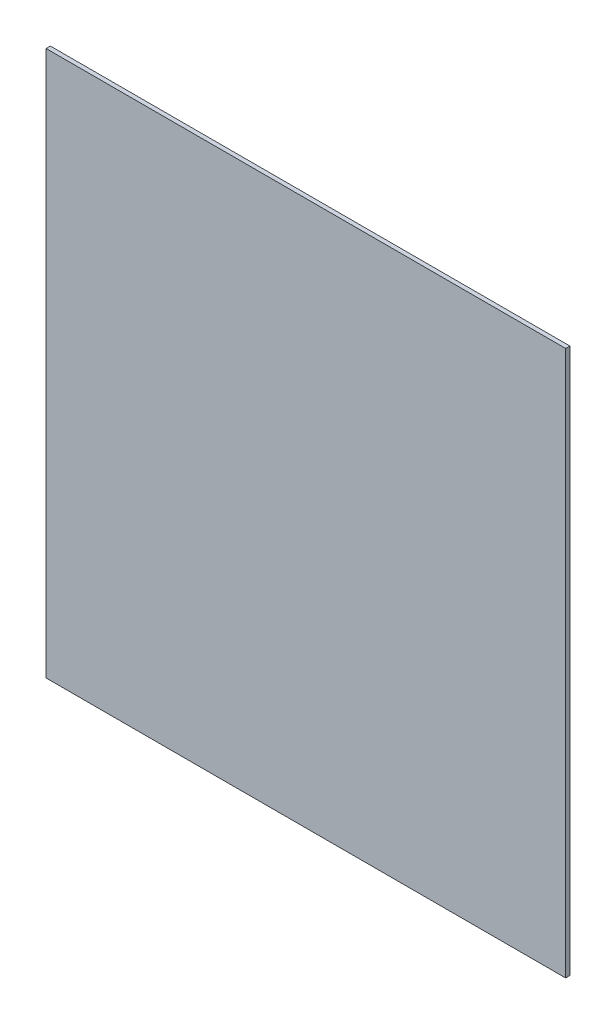
ISO-10303-21;
HEADER;
FILE_DESCRIPTION(('STEP AP214'),'2;1');
FILE_NAME('part.step','',(''),(''),'','','');
FILE_SCHEMA(('AUTOMOTIVE_DESIGN { 1 0 10303 214 1 1 1 1 }'));
ENDSEC;
DATA;
#1=APPLICATION_CONTEXT('core data for automotive mechanical design processes');
#2=APPLICATION_PROTOCOL_DEFINITION('international standard','automotive_design',2000,#1);
#3=PRODUCT_CONTEXT('',#1,'mechanical');
#4=PRODUCT('Part','Part','',(#3));
#5=PRODUCT_RELATED_PRODUCT_CATEGORY('part','',(#4));
#6=PRODUCT_DEFINITION_FORMATION('','',#4);
#7=PRODUCT_DEFINITION_CONTEXT('part definition',#1,'design');
#8=PRODUCT_DEFINITION('design','',#6,#7);
#9=PRODUCT_DEFINITION_SHAPE('','',#8);
#10=(LENGTH_UNIT() NAMED_UNIT(*) SI_UNIT(.MILLI.,.METRE.));
#11=(NAMED_UNIT(*) PLANE_ANGLE_UNIT() SI_UNIT($,.RADIAN.));
#12=(NAMED_UNIT(*) SI_UNIT($,.STERADIAN.) SOLID_ANGLE_UNIT());
#13=UNCERTAINTY_MEASURE_WITH_UNIT(LENGTH_MEASURE(1.E-05),#10,'distance_accuracy_value','');
#14=(GEOMETRIC_REPRESENTATION_CONTEXT(3) GLOBAL_UNCERTAINTY_ASSIGNED_CONTEXT((#13)) GLOBAL_UNIT_ASSIGNED_CONTEXT((#10,
#11,#12)) REPRESENTATION_CONTEXT('',''));
#15=CARTESIAN_POINT('',(0.,0.,0.));
#16=DIRECTION('',(0.,0.,1.));
#17=DIRECTION('',(1.,0.,0.));
#18=AXIS2_PLACEMENT_3D('',#15,#16,#17);
#19=CARTESIAN_POINT('',(193.675,0.,1.5875));
#20=DIRECTION('',(-1.,0.,0.));
#21=DIRECTION('',(0.,1.,0.));
#22=AXIS2_PLACEMENT_3D('',#19,#20,#21);
#23=PLANE('',#22);
#24=DIRECTION('',(0.,0.,1.));
#25=VECTOR('',#24,1.);
#26=CARTESIAN_POINT('',(193.675,0.,1.5875));
#27=LINE('',#26,#25);
#28=CARTESIAN_POINT('',(193.675,0.,0.));
#29=VERTEX_POINT('',#28);
#30=CARTESIAN_POINT('',(193.675,0.,1.5875));
#31=VERTEX_POINT('',#30);
#32=EDGE_CURVE('E11',#29,#31,#27,.T.);
#33=ORIENTED_EDGE('',*,*,#32,.F.);
#34=DIRECTION('',(0.,1.,0.));
#35=VECTOR('',#34,1.);
#36=CARTESIAN_POINT('',(193.675,0.,0.));
#37=LINE('',#36,#35);
#38=CARTESIAN_POINT('',(193.675,203.2,0.));
#39=VERTEX_POINT('',#38);
#40=EDGE_CURVE('E99',#29,#39,#37,.T.);
#41=ORIENTED_EDGE('',*,*,#40,.T.);
#42=DIRECTION('',(0.,0.,1.));
#43=VECTOR('',#42,1.);
#44=CARTESIAN_POINT('',(193.675,203.2,1.5875));
#45=LINE('',#44,#43);
#46=CARTESIAN_POINT('',(193.675,203.2,1.5875));
#47=VERTEX_POINT('',#46);
#48=EDGE_CURVE('E55',#39,#47,#45,.T.);
#49=ORIENTED_EDGE('',*,*,#48,.T.);
#50=DIRECTION('',(0.,1.,0.));
#51=VECTOR('',#50,1.);
#52=CARTESIAN_POINT('',(193.675,0.,1.5875));
#53=LINE('',#52,#51);
#54=EDGE_CURVE('E112',#31,#47,#53,.T.);
#55=ORIENTED_EDGE('',*,*,#54,.F.);
#56=EDGE_LOOP('',(#33,#41,#49,#55));
#57=FACE_BOUND('',#56,.T.);
#58=ADVANCED_FACE('F45',(#57),#23,.F.);
#59=CARTESIAN_POINT('',(0.,203.2,1.5875));
#60=DIRECTION('',(0.,-1.,0.));
#61=DIRECTION('',(-1.,0.,0.));
#62=AXIS2_PLACEMENT_3D('',#59,#60,#61);
#63=PLANE('',#62);
#64=ORIENTED_EDGE('',*,*,#48,.F.);
#65=DIRECTION('',(-1.,0.,0.));
#66=VECTOR('',#65,1.);
#67=CARTESIAN_POINT('',(0.,203.2,0.));
#68=LINE('',#67,#66);
#69=CARTESIAN_POINT('',(0.,203.2,0.));
#70=VERTEX_POINT('',#69);
#71=EDGE_CURVE('E106',#39,#70,#68,.T.);
#72=ORIENTED_EDGE('',*,*,#71,.T.);
#73=DIRECTION('',(0.,0.,1.));
#74=VECTOR('',#73,1.);
#75=CARTESIAN_POINT('',(0.,203.2,1.5875));
#76=LINE('',#75,#74);
#77=CARTESIAN_POINT('',(0.,203.2,1.5875));
#78=VERTEX_POINT('',#77);
#79=EDGE_CURVE('E63',#70,#78,#76,.T.);
#80=ORIENTED_EDGE('',*,*,#79,.T.);
#81=DIRECTION('',(-1.,0.,0.));
#82=VECTOR('',#81,1.);
#83=CARTESIAN_POINT('',(0.,203.2,1.5875));
#84=LINE('',#83,#82);
#85=EDGE_CURVE('E93',#47,#78,#84,.T.);
#86=ORIENTED_EDGE('',*,*,#85,.F.);
#87=EDGE_LOOP('',(#64,#72,#80,#86));
#88=FACE_BOUND('',#87,.T.);
#89=ADVANCED_FACE('F116',(#88),#63,.F.);
#90=CARTESIAN_POINT('',(0.,0.,1.5875));
#91=DIRECTION('',(1.,0.,0.));
#92=DIRECTION('',(0.,-1.,0.));
#93=AXIS2_PLACEMENT_3D('',#90,#91,#92);
#94=PLANE('',#93);
#95=ORIENTED_EDGE('',*,*,#79,.F.);
#96=DIRECTION('',(0.,1.,0.));
#97=VECTOR('',#96,1.);
#98=CARTESIAN_POINT('',(0.,0.,0.));
#99=LINE('',#98,#97);
#100=CARTESIAN_POINT('',(0.,0.,0.));
#101=VERTEX_POINT('',#100);
#102=EDGE_CURVE('E98',#70,#101,#99,.F.);
#103=ORIENTED_EDGE('',*,*,#102,.T.);
#104=DIRECTION('',(0.,0.,1.));
#105=VECTOR('',#104,1.);
#106=CARTESIAN_POINT('',(0.,0.,1.5875));
#107=LINE('',#106,#105);
#108=CARTESIAN_POINT('',(0.,0.,1.5875));
#109=VERTEX_POINT('',#108);
#110=EDGE_CURVE('E49',#101,#109,#107,.T.);
#111=ORIENTED_EDGE('',*,*,#110,.T.);
#112=DIRECTION('',(0.,-1.,0.));
#113=VECTOR('',#112,1.);
#114=CARTESIAN_POINT('',(0.,0.,1.5875));
#115=LINE('',#114,#113);
#116=EDGE_CURVE('E108',#78,#109,#115,.T.);
#117=ORIENTED_EDGE('',*,*,#116,.F.);
#118=EDGE_LOOP('',(#95,#103,#111,#117));
#119=FACE_BOUND('',#118,.T.);
#120=ADVANCED_FACE('F101',(#119),#94,.F.);
#121=CARTESIAN_POINT('',(0.,0.,1.5875));
#122=DIRECTION('',(0.,1.,0.));
#123=DIRECTION('',(1.,0.,0.));
#124=AXIS2_PLACEMENT_3D('',#121,#122,#123);
#125=PLANE('',#124);
#126=DIRECTION('',(-1.,0.,0.));
#127=VECTOR('',#126,1.);
#128=CARTESIAN_POINT('',(0.,0.,0.));
#129=LINE('',#128,#127);
#130=EDGE_CURVE('E87',#101,#29,#129,.F.);
#131=ORIENTED_EDGE('',*,*,#130,.T.);
#132=ORIENTED_EDGE('',*,*,#32,.T.);
#133=DIRECTION('',(1.,0.,0.));
#134=VECTOR('',#133,1.);
#135=CARTESIAN_POINT('',(0.,0.,1.5875));
#136=LINE('',#135,#134);
#137=EDGE_CURVE('E89',#109,#31,#136,.T.);
#138=ORIENTED_EDGE('',*,*,#137,.F.);
#139=ORIENTED_EDGE('',*,*,#110,.F.);
#140=EDGE_LOOP('',(#131,#132,#138,#139));
#141=FACE_BOUND('',#140,.T.);
#142=ADVANCED_FACE('F47',(#141),#125,.F.);
#143=CARTESIAN_POINT('',(0.,0.,1.5875));
#144=DIRECTION('',(0.,0.,-1.));
#145=DIRECTION('',(-1.,0.,0.));
#146=AXIS2_PLACEMENT_3D('',#143,#144,#145);
#147=PLANE('',#146);
#148=ORIENTED_EDGE('',*,*,#116,.T.);
#149=ORIENTED_EDGE('',*,*,#137,.T.);
#150=ORIENTED_EDGE('',*,*,#54,.T.);
#151=ORIENTED_EDGE('',*,*,#85,.T.);
#152=EDGE_LOOP('',(#148,#149,#150,#151));
#153=FACE_BOUND('',#152,.T.);
#154=ADVANCED_FACE('F115',(#153),#147,.F.);
#155=CARTESIAN_POINT('',(0.,0.,0.));
#156=DIRECTION('',(0.,0.,-1.));
#157=DIRECTION('',(-1.,0.,0.));
#158=AXIS2_PLACEMENT_3D('',#155,#156,#157);
#159=PLANE('',#158);
#160=ORIENTED_EDGE('',*,*,#102,.F.);
#161=ORIENTED_EDGE('',*,*,#71,.F.);
#162=ORIENTED_EDGE('',*,*,#40,.F.);
#163=ORIENTED_EDGE('',*,*,#130,.F.);
#164=EDGE_LOOP('',(#160,#161,#162,#163));
#165=FACE_BOUND('',#164,.T.);
#166=ADVANCED_FACE('F96',(#165),#159,.T.);
#167=CLOSED_SHELL('',(#58,#89,#120,#142,#154,#166));
#168=MANIFOLD_SOLID_BREP('B2',#167);
#169=ADVANCED_BREP_SHAPE_REPRESENTATION('',(#18,#168),#14);
#170=SHAPE_DEFINITION_REPRESENTATION(#9,#169);
ENDSEC;
END-ISO-10303-21;
